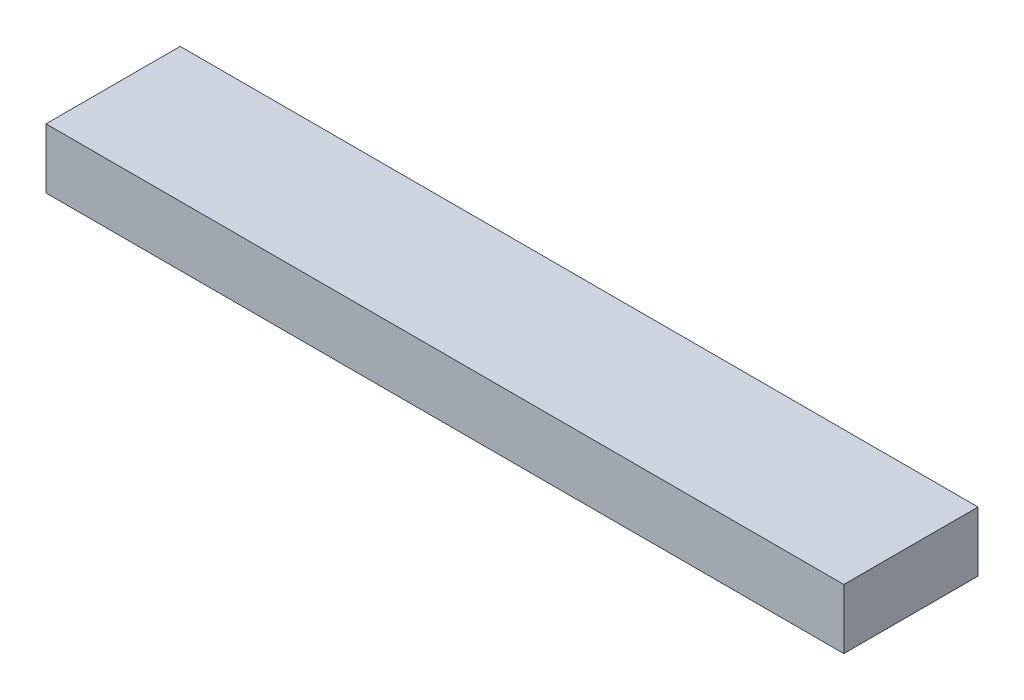
ISO-10303-21;
HEADER;
FILE_DESCRIPTION(('STEP AP214'),'2;1');
FILE_NAME('part.step','',(''),(''),'','','');
FILE_SCHEMA(('AUTOMOTIVE_DESIGN { 1 0 10303 214 1 1 1 1 }'));
ENDSEC;
DATA;
#1=APPLICATION_CONTEXT('core data for automotive mechanical design processes');
#2=APPLICATION_PROTOCOL_DEFINITION('international standard','automotive_design',2000,#1);
#3=PRODUCT_CONTEXT('',#1,'mechanical');
#4=PRODUCT('Part','Part','',(#3));
#5=PRODUCT_RELATED_PRODUCT_CATEGORY('part','',(#4));
#6=PRODUCT_DEFINITION_FORMATION('','',#4);
#7=PRODUCT_DEFINITION_CONTEXT('part definition',#1,'design');
#8=PRODUCT_DEFINITION('design','',#6,#7);
#9=PRODUCT_DEFINITION_SHAPE('','',#8);
#10=(LENGTH_UNIT() NAMED_UNIT(*) SI_UNIT(.MILLI.,.METRE.));
#11=(NAMED_UNIT(*) PLANE_ANGLE_UNIT() SI_UNIT($,.RADIAN.));
#12=(NAMED_UNIT(*) SI_UNIT($,.STERADIAN.) SOLID_ANGLE_UNIT());
#13=UNCERTAINTY_MEASURE_WITH_UNIT(LENGTH_MEASURE(1.E-05),#10,'distance_accuracy_value','');
#14=(GEOMETRIC_REPRESENTATION_CONTEXT(3) GLOBAL_UNCERTAINTY_ASSIGNED_CONTEXT((#13)) GLOBAL_UNIT_ASSIGNED_CONTEXT((#10,
#11,#12)) REPRESENTATION_CONTEXT('',''));
#15=CARTESIAN_POINT('',(0.,0.,0.));
#16=DIRECTION('',(0.,0.,1.));
#17=DIRECTION('',(1.,0.,0.));
#18=AXIS2_PLACEMENT_3D('',#15,#16,#17);
#19=CARTESIAN_POINT('',(-33.3,-2.50000000000001,11.2));
#20=DIRECTION('',(1.,0.,0.));
#21=DIRECTION('',(0.,0.,-1.));
#22=AXIS2_PLACEMENT_3D('',#19,#20,#21);
#23=PLANE('',#22);
#24=DIRECTION('',(0.,-1.,0.));
#25=VECTOR('',#24,1.);
#26=CARTESIAN_POINT('',(-33.3,-2.50000000000001,0.));
#27=LINE('',#26,#25);
#28=CARTESIAN_POINT('',(-33.3,2.5,0.));
#29=VERTEX_POINT('',#28);
#30=CARTESIAN_POINT('',(-33.3,-2.50000000000001,0.));
#31=VERTEX_POINT('',#30);
#32=EDGE_CURVE('E95',#29,#31,#27,.T.);
#33=ORIENTED_EDGE('',*,*,#32,.T.);
#34=DIRECTION('',(0.,0.,-1.));
#35=VECTOR('',#34,1.);
#36=CARTESIAN_POINT('',(-33.3,-2.50000000000001,11.2));
#37=LINE('',#36,#35);
#38=CARTESIAN_POINT('',(-33.3,-2.50000000000001,11.2));
#39=VERTEX_POINT('',#38);
#40=EDGE_CURVE('E11',#39,#31,#37,.T.);
#41=ORIENTED_EDGE('',*,*,#40,.F.);
#42=DIRECTION('',(0.,-1.,0.));
#43=VECTOR('',#42,1.);
#44=CARTESIAN_POINT('',(-33.3,-2.50000000000001,11.2));
#45=LINE('',#44,#43);
#46=CARTESIAN_POINT('',(-33.3,2.5,11.2));
#47=VERTEX_POINT('',#46);
#48=EDGE_CURVE('E83',#47,#39,#45,.T.);
#49=ORIENTED_EDGE('',*,*,#48,.F.);
#50=DIRECTION('',(0.,0.,-1.));
#51=VECTOR('',#50,1.);
#52=CARTESIAN_POINT('',(-33.3,2.5,11.2));
#53=LINE('',#52,#51);
#54=EDGE_CURVE('E91',#47,#29,#53,.T.);
#55=ORIENTED_EDGE('',*,*,#54,.T.);
#56=EDGE_LOOP('',(#33,#41,#49,#55));
#57=FACE_BOUND('',#56,.T.);
#58=ADVANCED_FACE('F32',(#57),#23,.F.);
#59=CARTESIAN_POINT('',(33.3,-2.5,11.2));
#60=DIRECTION('',(0.,1.,0.));
#61=DIRECTION('',(-1.,0.,0.));
#62=AXIS2_PLACEMENT_3D('',#59,#60,#61);
#63=PLANE('',#62);
#64=DIRECTION('',(1.,0.,0.));
#65=VECTOR('',#64,1.);
#66=CARTESIAN_POINT('',(33.3,-2.5,0.));
#67=LINE('',#66,#65);
#68=CARTESIAN_POINT('',(33.3,-2.5,0.));
#69=VERTEX_POINT('',#68);
#70=EDGE_CURVE('E87',#31,#69,#67,.T.);
#71=ORIENTED_EDGE('',*,*,#70,.T.);
#72=DIRECTION('',(0.,0.,-1.));
#73=VECTOR('',#72,1.);
#74=CARTESIAN_POINT('',(33.3,-2.5,11.2));
#75=LINE('',#74,#73);
#76=CARTESIAN_POINT('',(33.3,-2.5,11.2));
#77=VERTEX_POINT('',#76);
#78=EDGE_CURVE('E40',#77,#69,#75,.T.);
#79=ORIENTED_EDGE('',*,*,#78,.F.);
#80=DIRECTION('',(1.,0.,0.));
#81=VECTOR('',#80,1.);
#82=CARTESIAN_POINT('',(33.3,-2.5,11.2));
#83=LINE('',#82,#81);
#84=EDGE_CURVE('E78',#39,#77,#83,.T.);
#85=ORIENTED_EDGE('',*,*,#84,.F.);
#86=ORIENTED_EDGE('',*,*,#40,.T.);
#87=EDGE_LOOP('',(#71,#79,#85,#86));
#88=FACE_BOUND('',#87,.T.);
#89=ADVANCED_FACE('F86',(#88),#63,.F.);
#90=CARTESIAN_POINT('',(33.3,-2.5,11.2));
#91=DIRECTION('',(-1.,0.,0.));
#92=DIRECTION('',(0.,0.,1.));
#93=AXIS2_PLACEMENT_3D('',#90,#91,#92);
#94=PLANE('',#93);
#95=DIRECTION('',(0.,1.,0.));
#96=VECTOR('',#95,1.);
#97=CARTESIAN_POINT('',(33.3,-2.5,0.));
#98=LINE('',#97,#96);
#99=CARTESIAN_POINT('',(33.3,2.5,0.));
#100=VERTEX_POINT('',#99);
#101=EDGE_CURVE('E65',#69,#100,#98,.T.);
#102=ORIENTED_EDGE('',*,*,#101,.T.);
#103=DIRECTION('',(0.,0.,-1.));
#104=VECTOR('',#103,1.);
#105=CARTESIAN_POINT('',(33.3,2.5,11.2));
#106=LINE('',#105,#104);
#107=CARTESIAN_POINT('',(33.3,2.5,11.2));
#108=VERTEX_POINT('',#107);
#109=EDGE_CURVE('E88',#108,#100,#106,.T.);
#110=ORIENTED_EDGE('',*,*,#109,.F.);
#111=DIRECTION('',(0.,1.,0.));
#112=VECTOR('',#111,1.);
#113=CARTESIAN_POINT('',(33.3,-2.5,11.2));
#114=LINE('',#113,#112);
#115=EDGE_CURVE('E81',#77,#108,#114,.T.);
#116=ORIENTED_EDGE('',*,*,#115,.F.);
#117=ORIENTED_EDGE('',*,*,#78,.T.);
#118=EDGE_LOOP('',(#102,#110,#116,#117));
#119=FACE_BOUND('',#118,.T.);
#120=ADVANCED_FACE('F89',(#119),#94,.F.);
#121=CARTESIAN_POINT('',(33.3,2.5,11.2));
#122=DIRECTION('',(0.,-1.,0.));
#123=DIRECTION('',(1.,0.,0.));
#124=AXIS2_PLACEMENT_3D('',#121,#122,#123);
#125=PLANE('',#124);
#126=DIRECTION('',(-1.,0.,0.));
#127=VECTOR('',#126,1.);
#128=CARTESIAN_POINT('',(33.3,2.5,0.));
#129=LINE('',#128,#127);
#130=EDGE_CURVE('E71',#100,#29,#129,.T.);
#131=ORIENTED_EDGE('',*,*,#130,.T.);
#132=ORIENTED_EDGE('',*,*,#54,.F.);
#133=DIRECTION('',(-1.,0.,0.));
#134=VECTOR('',#133,1.);
#135=CARTESIAN_POINT('',(33.3,2.5,11.2));
#136=LINE('',#135,#134);
#137=EDGE_CURVE('E48',#108,#47,#136,.T.);
#138=ORIENTED_EDGE('',*,*,#137,.F.);
#139=ORIENTED_EDGE('',*,*,#109,.T.);
#140=EDGE_LOOP('',(#131,#132,#138,#139));
#141=FACE_BOUND('',#140,.T.);
#142=ADVANCED_FACE('F102',(#141),#125,.F.);
#143=CARTESIAN_POINT('',(-33.3,2.5,11.2));
#144=DIRECTION('',(0.,0.,1.));
#145=DIRECTION('',(1.,0.,0.));
#146=AXIS2_PLACEMENT_3D('',#143,#144,#145);
#147=PLANE('',#146);
#148=ORIENTED_EDGE('',*,*,#48,.T.);
#149=ORIENTED_EDGE('',*,*,#84,.T.);
#150=ORIENTED_EDGE('',*,*,#115,.T.);
#151=ORIENTED_EDGE('',*,*,#137,.T.);
#152=EDGE_LOOP('',(#148,#149,#150,#151));
#153=FACE_BOUND('',#152,.T.);
#154=ADVANCED_FACE('F79',(#153),#147,.T.);
#155=CARTESIAN_POINT('',(-33.3,2.5,0.));
#156=DIRECTION('',(0.,0.,1.));
#157=DIRECTION('',(1.,0.,0.));
#158=AXIS2_PLACEMENT_3D('',#155,#156,#157);
#159=PLANE('',#158);
#160=ORIENTED_EDGE('',*,*,#32,.F.);
#161=ORIENTED_EDGE('',*,*,#130,.F.);
#162=ORIENTED_EDGE('',*,*,#101,.F.);
#163=ORIENTED_EDGE('',*,*,#70,.F.);
#164=EDGE_LOOP('',(#160,#161,#162,#163));
#165=FACE_BOUND('',#164,.T.);
#166=ADVANCED_FACE('F105',(#165),#159,.F.);
#167=CLOSED_SHELL('',(#58,#89,#120,#142,#154,#166));
#168=MANIFOLD_SOLID_BREP('B2',#167);
#169=ADVANCED_BREP_SHAPE_REPRESENTATION('',(#18,#168),#14);
#170=SHAPE_DEFINITION_REPRESENTATION(#9,#169);
ENDSEC;
END-ISO-10303-21;
